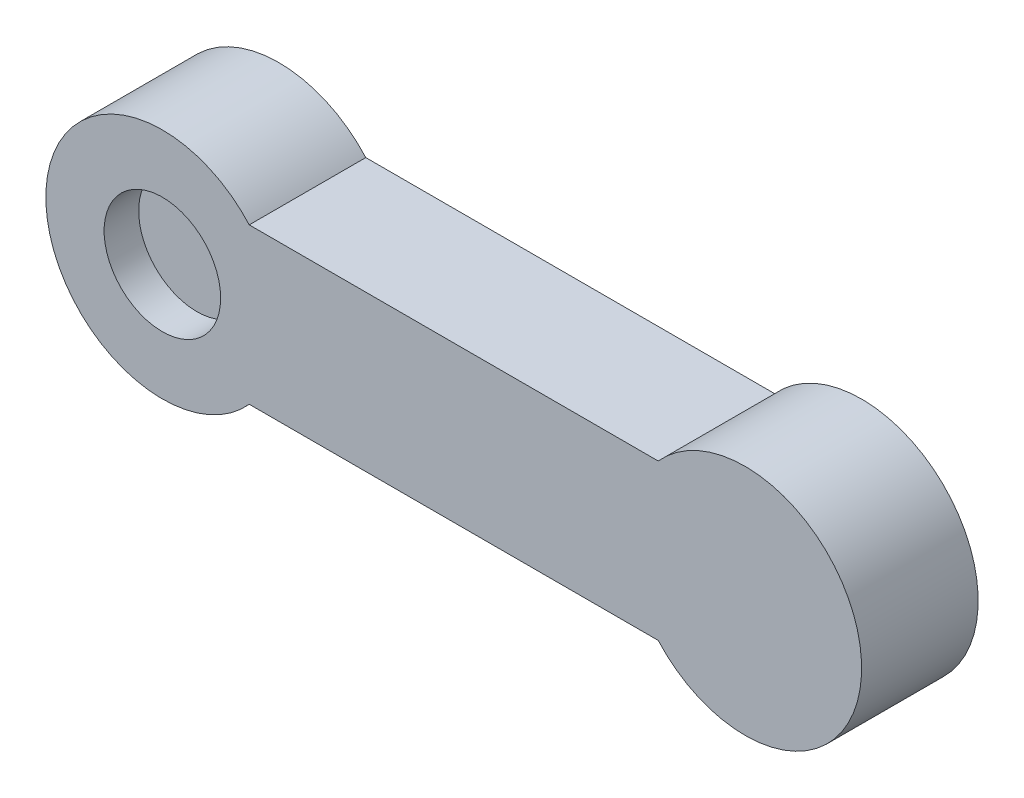
ISO-10303-21;
HEADER;
FILE_DESCRIPTION(('STEP AP214'),'2;1');
FILE_NAME('part.step','',(''),(''),'','','');
FILE_SCHEMA(('AUTOMOTIVE_DESIGN { 1 0 10303 214 1 1 1 1 }'));
ENDSEC;
DATA;
#1=APPLICATION_CONTEXT('core data for automotive mechanical design processes');
#2=APPLICATION_PROTOCOL_DEFINITION('international standard','automotive_design',2000,#1);
#3=PRODUCT_CONTEXT('',#1,'mechanical');
#4=PRODUCT('Part','Part','',(#3));
#5=PRODUCT_RELATED_PRODUCT_CATEGORY('part','',(#4));
#6=PRODUCT_DEFINITION_FORMATION('','',#4);
#7=PRODUCT_DEFINITION_CONTEXT('part definition',#1,'design');
#8=PRODUCT_DEFINITION('design','',#6,#7);
#9=PRODUCT_DEFINITION_SHAPE('','',#8);
#10=(LENGTH_UNIT() NAMED_UNIT(*) SI_UNIT(.MILLI.,.METRE.));
#11=(NAMED_UNIT(*) PLANE_ANGLE_UNIT() SI_UNIT($,.RADIAN.));
#12=(NAMED_UNIT(*) SI_UNIT($,.STERADIAN.) SOLID_ANGLE_UNIT());
#13=UNCERTAINTY_MEASURE_WITH_UNIT(LENGTH_MEASURE(1.E-05),#10,'distance_accuracy_value','');
#14=(GEOMETRIC_REPRESENTATION_CONTEXT(3) GLOBAL_UNCERTAINTY_ASSIGNED_CONTEXT((#13)) GLOBAL_UNIT_ASSIGNED_CONTEXT((#10,
#11,#12)) REPRESENTATION_CONTEXT('',''));
#15=CARTESIAN_POINT('',(0.,0.,0.));
#16=DIRECTION('',(0.,0.,1.));
#17=DIRECTION('',(1.,0.,0.));
#18=AXIS2_PLACEMENT_3D('',#15,#16,#17);
#19=CARTESIAN_POINT('',(0.,0.,0.));
#20=DIRECTION('',(0.,0.,1.));
#21=DIRECTION('',(1.,0.,0.));
#22=AXIS2_PLACEMENT_3D('',#19,#20,#21);
#23=PLANE('',#22);
#24=CARTESIAN_POINT('',(150.,0.,0.));
#25=DIRECTION('',(0.,0.,1.));
#26=DIRECTION('',(1.,0.,0.));
#27=AXIS2_PLACEMENT_3D('',#24,#25,#26);
#28=CIRCLE('',#27,30.);
#29=CARTESIAN_POINT('',(127.639320225002,-20.,0.));
#30=VERTEX_POINT('',#29);
#31=CARTESIAN_POINT('',(127.639320225002,20.,0.));
#32=VERTEX_POINT('',#31);
#33=EDGE_CURVE('E123',#30,#32,#28,.T.);
#34=ORIENTED_EDGE('',*,*,#33,.F.);
#35=DIRECTION('',(1.,0.,0.));
#36=VECTOR('',#35,1.);
#37=CARTESIAN_POINT('',(0.,-20.,0.));
#38=LINE('',#37,#36);
#39=CARTESIAN_POINT('',(22.3606797749979,-20.,0.));
#40=VERTEX_POINT('',#39);
#41=EDGE_CURVE('E116',#40,#30,#38,.T.);
#42=ORIENTED_EDGE('',*,*,#41,.F.);
#43=CARTESIAN_POINT('',(0.,0.,0.));
#44=DIRECTION('',(0.,0.,1.));
#45=DIRECTION('',(1.,0.,0.));
#46=AXIS2_PLACEMENT_3D('',#43,#44,#45);
#47=CIRCLE('',#46,30.);
#48=CARTESIAN_POINT('',(22.3606797749979,20.,0.));
#49=VERTEX_POINT('',#48);
#50=EDGE_CURVE('E121',#49,#40,#47,.T.);
#51=ORIENTED_EDGE('',*,*,#50,.F.);
#52=DIRECTION('',(1.,0.,0.));
#53=VECTOR('',#52,1.);
#54=CARTESIAN_POINT('',(0.,20.,0.));
#55=LINE('',#54,#53);
#56=EDGE_CURVE('E124',#49,#32,#55,.T.);
#57=ORIENTED_EDGE('',*,*,#56,.T.);
#58=EDGE_LOOP('',(#34,#42,#51,#57));
#59=FACE_BOUND('',#58,.T.);
#60=ADVANCED_FACE('F69',(#59),#23,.F.);
#61=CARTESIAN_POINT('',(0.,0.,30.));
#62=DIRECTION('',(0.,0.,1.));
#63=DIRECTION('',(1.,0.,0.));
#64=AXIS2_PLACEMENT_3D('',#61,#62,#63);
#65=PLANE('',#64);
#66=CARTESIAN_POINT('',(0.,0.,30.));
#67=DIRECTION('',(0.,0.,1.));
#68=DIRECTION('',(1.,0.,0.));
#69=AXIS2_PLACEMENT_3D('',#66,#67,#68);
#70=CIRCLE('',#69,15.);
#71=CARTESIAN_POINT('',(15.,0.,30.));
#72=VERTEX_POINT('',#71);
#73=EDGE_CURVE('E195',#72,#72,#70,.T.);
#74=ORIENTED_EDGE('',*,*,#73,.F.);
#75=EDGE_LOOP('',(#74));
#76=FACE_BOUND('',#75,.T.);
#77=DIRECTION('',(1.,0.,0.));
#78=VECTOR('',#77,1.);
#79=CARTESIAN_POINT('',(0.,-20.,30.));
#80=LINE('',#79,#78);
#81=CARTESIAN_POINT('',(22.3606797749979,-20.,30.));
#82=VERTEX_POINT('',#81);
#83=CARTESIAN_POINT('',(127.639320225002,-20.,30.));
#84=VERTEX_POINT('',#83);
#85=EDGE_CURVE('E101',#82,#84,#80,.T.);
#86=ORIENTED_EDGE('',*,*,#85,.T.);
#87=CARTESIAN_POINT('',(150.,0.,30.));
#88=DIRECTION('',(0.,0.,1.));
#89=DIRECTION('',(1.,0.,0.));
#90=AXIS2_PLACEMENT_3D('',#87,#88,#89);
#91=CIRCLE('',#90,30.);
#92=CARTESIAN_POINT('',(127.639320225002,20.,30.));
#93=VERTEX_POINT('',#92);
#94=EDGE_CURVE('E125',#84,#93,#91,.T.);
#95=ORIENTED_EDGE('',*,*,#94,.T.);
#96=DIRECTION('',(1.,0.,0.));
#97=VECTOR('',#96,1.);
#98=CARTESIAN_POINT('',(0.,20.,30.));
#99=LINE('',#98,#97);
#100=CARTESIAN_POINT('',(22.3606797749979,20.,30.));
#101=VERTEX_POINT('',#100);
#102=EDGE_CURVE('E108',#101,#93,#99,.T.);
#103=ORIENTED_EDGE('',*,*,#102,.F.);
#104=CARTESIAN_POINT('',(0.,0.,30.));
#105=DIRECTION('',(0.,0.,1.));
#106=DIRECTION('',(1.,0.,0.));
#107=AXIS2_PLACEMENT_3D('',#104,#105,#106);
#108=CIRCLE('',#107,30.);
#109=EDGE_CURVE('E128',#101,#82,#108,.T.);
#110=ORIENTED_EDGE('',*,*,#109,.T.);
#111=EDGE_LOOP('',(#86,#95,#103,#110));
#112=FACE_BOUND('',#111,.T.);
#113=ADVANCED_FACE('F145',(#76,#112),#65,.T.);
#114=CARTESIAN_POINT('',(0.,0.,30.));
#115=DIRECTION('',(0.,0.,-1.));
#116=DIRECTION('',(-1.,0.,0.));
#117=AXIS2_PLACEMENT_3D('',#114,#115,#116);
#118=CYLINDRICAL_SURFACE('',#117,30.);
#119=DIRECTION('',(0.,0.,-1.));
#120=VECTOR('',#119,1.);
#121=CARTESIAN_POINT('',(22.3606797749979,-20.,30.));
#122=LINE('',#121,#120);
#123=EDGE_CURVE('E12',#82,#40,#122,.T.);
#124=ORIENTED_EDGE('',*,*,#123,.F.);
#125=ORIENTED_EDGE('',*,*,#109,.F.);
#126=DIRECTION('',(0.,0.,-1.));
#127=VECTOR('',#126,1.);
#128=CARTESIAN_POINT('',(22.3606797749979,20.,30.));
#129=LINE('',#128,#127);
#130=EDGE_CURVE('E78',#101,#49,#129,.T.);
#131=ORIENTED_EDGE('',*,*,#130,.T.);
#132=ORIENTED_EDGE('',*,*,#50,.T.);
#133=EDGE_LOOP('',(#124,#125,#131,#132));
#134=FACE_BOUND('',#133,.T.);
#135=ADVANCED_FACE('F127',(#134),#118,.T.);
#136=CARTESIAN_POINT('',(150.,0.,30.));
#137=DIRECTION('',(0.,0.,-1.));
#138=DIRECTION('',(-1.,0.,0.));
#139=AXIS2_PLACEMENT_3D('',#136,#137,#138);
#140=CYLINDRICAL_SURFACE('',#139,30.);
#141=ORIENTED_EDGE('',*,*,#94,.F.);
#142=DIRECTION('',(0.,0.,-1.));
#143=VECTOR('',#142,1.);
#144=CARTESIAN_POINT('',(127.639320225002,-20.,30.));
#145=LINE('',#144,#143);
#146=EDGE_CURVE('E129',#84,#30,#145,.T.);
#147=ORIENTED_EDGE('',*,*,#146,.T.);
#148=ORIENTED_EDGE('',*,*,#33,.T.);
#149=DIRECTION('',(0.,0.,-1.));
#150=VECTOR('',#149,1.);
#151=CARTESIAN_POINT('',(127.639320225002,20.,30.));
#152=LINE('',#151,#150);
#153=EDGE_CURVE('E132',#93,#32,#152,.T.);
#154=ORIENTED_EDGE('',*,*,#153,.F.);
#155=EDGE_LOOP('',(#141,#147,#148,#154));
#156=FACE_BOUND('',#155,.T.);
#157=ADVANCED_FACE('F71',(#156),#140,.T.);
#158=CARTESIAN_POINT('',(0.,20.,30.));
#159=DIRECTION('',(0.,1.,0.));
#160=DIRECTION('',(-1.,0.,0.));
#161=AXIS2_PLACEMENT_3D('',#158,#159,#160);
#162=PLANE('',#161);
#163=ORIENTED_EDGE('',*,*,#130,.F.);
#164=ORIENTED_EDGE('',*,*,#102,.T.);
#165=ORIENTED_EDGE('',*,*,#153,.T.);
#166=ORIENTED_EDGE('',*,*,#56,.F.);
#167=EDGE_LOOP('',(#163,#164,#165,#166));
#168=FACE_BOUND('',#167,.T.);
#169=ADVANCED_FACE('F142',(#168),#162,.T.);
#170=CARTESIAN_POINT('',(0.,-20.,30.));
#171=DIRECTION('',(0.,1.,0.));
#172=DIRECTION('',(0.,0.,1.));
#173=AXIS2_PLACEMENT_3D('',#170,#171,#172);
#174=PLANE('',#173);
#175=ORIENTED_EDGE('',*,*,#85,.F.);
#176=ORIENTED_EDGE('',*,*,#123,.T.);
#177=ORIENTED_EDGE('',*,*,#41,.T.);
#178=ORIENTED_EDGE('',*,*,#146,.F.);
#179=EDGE_LOOP('',(#175,#176,#177,#178));
#180=FACE_BOUND('',#179,.T.);
#181=ADVANCED_FACE('F115',(#180),#174,.F.);
#182=CARTESIAN_POINT('',(0.,0.,21.1));
#183=DIRECTION('',(0.,0.,1.));
#184=DIRECTION('',(1.,0.,0.));
#185=AXIS2_PLACEMENT_3D('',#182,#183,#184);
#186=CYLINDRICAL_SURFACE('',#185,15.);
#187=CARTESIAN_POINT('',(0.,0.,21.1));
#188=DIRECTION('',(0.,0.,1.));
#189=DIRECTION('',(1.,0.,0.));
#190=AXIS2_PLACEMENT_3D('',#187,#188,#189);
#191=CIRCLE('',#190,15.);
#192=CARTESIAN_POINT('',(15.,0.,21.1));
#193=VERTEX_POINT('',#192);
#194=EDGE_CURVE('E141',#193,#193,#191,.T.);
#195=ORIENTED_EDGE('',*,*,#194,.F.);
#196=EDGE_LOOP('',(#195));
#197=FACE_BOUND('',#196,.T.);
#198=ORIENTED_EDGE('',*,*,#73,.T.);
#199=EDGE_LOOP('',(#198));
#200=FACE_BOUND('',#199,.T.);
#201=ADVANCED_FACE('F149',(#197,#200),#186,.F.);
#202=CARTESIAN_POINT('',(0.,0.,21.1));
#203=DIRECTION('',(0.,0.,1.));
#204=DIRECTION('',(1.,0.,0.));
#205=AXIS2_PLACEMENT_3D('',#202,#203,#204);
#206=PLANE('',#205);
#207=ORIENTED_EDGE('',*,*,#194,.T.);
#208=EDGE_LOOP('',(#207));
#209=FACE_BOUND('',#208,.T.);
#210=ADVANCED_FACE('F160',(#209),#206,.T.);
#211=CLOSED_SHELL('',(#60,#113,#135,#157,#169,#181,#201,#210));
#212=MANIFOLD_SOLID_BREP('B2',#211);
#213=ADVANCED_BREP_SHAPE_REPRESENTATION('',(#18,#212),#14);
#214=SHAPE_DEFINITION_REPRESENTATION(#9,#213);
ENDSEC;
END-ISO-10303-21;
